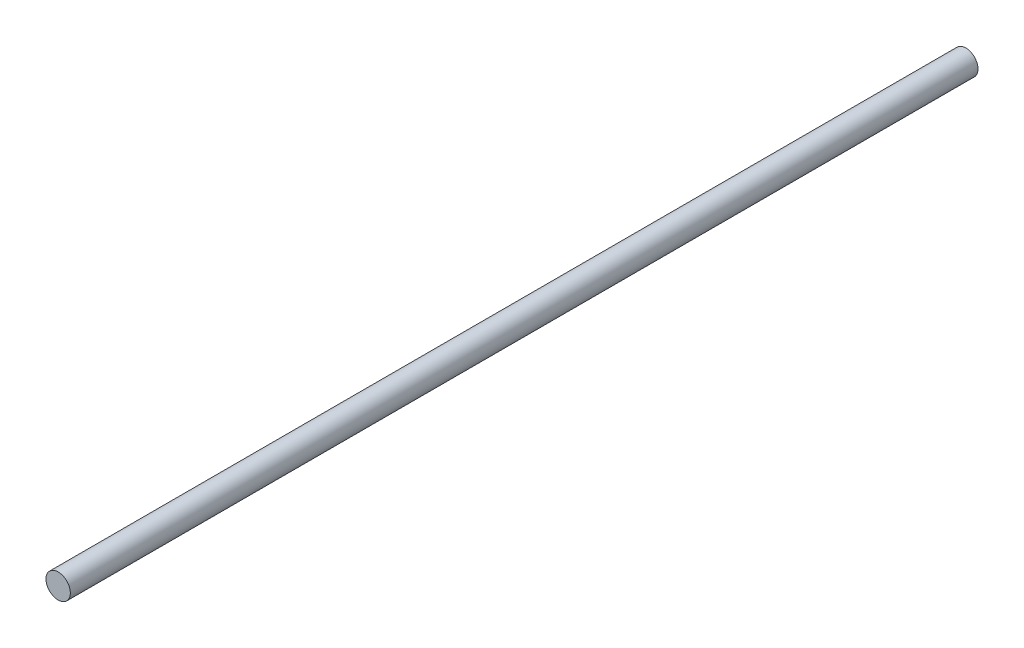
ISO-10303-21;
HEADER;
FILE_DESCRIPTION(('STEP AP214'),'2;1');
FILE_NAME('part.step','',(''),(''),'','','');
FILE_SCHEMA(('AUTOMOTIVE_DESIGN { 1 0 10303 214 1 1 1 1 }'));
ENDSEC;
DATA;
#1=APPLICATION_CONTEXT('core data for automotive mechanical design processes');
#2=APPLICATION_PROTOCOL_DEFINITION('international standard','automotive_design',2000,#1);
#3=PRODUCT_CONTEXT('',#1,'mechanical');
#4=PRODUCT('Part','Part','',(#3));
#5=PRODUCT_RELATED_PRODUCT_CATEGORY('part','',(#4));
#6=PRODUCT_DEFINITION_FORMATION('','',#4);
#7=PRODUCT_DEFINITION_CONTEXT('part definition',#1,'design');
#8=PRODUCT_DEFINITION('design','',#6,#7);
#9=PRODUCT_DEFINITION_SHAPE('','',#8);
#10=(LENGTH_UNIT() NAMED_UNIT(*) SI_UNIT(.MILLI.,.METRE.));
#11=(NAMED_UNIT(*) PLANE_ANGLE_UNIT() SI_UNIT($,.RADIAN.));
#12=(NAMED_UNIT(*) SI_UNIT($,.STERADIAN.) SOLID_ANGLE_UNIT());
#13=UNCERTAINTY_MEASURE_WITH_UNIT(LENGTH_MEASURE(1.E-05),#10,'distance_accuracy_value','');
#14=(GEOMETRIC_REPRESENTATION_CONTEXT(3) GLOBAL_UNCERTAINTY_ASSIGNED_CONTEXT((#13)) GLOBAL_UNIT_ASSIGNED_CONTEXT((#10,
#11,#12)) REPRESENTATION_CONTEXT('',''));
#15=CARTESIAN_POINT('',(0.,0.,0.));
#16=DIRECTION('',(0.,0.,1.));
#17=DIRECTION('',(1.,0.,0.));
#18=AXIS2_PLACEMENT_3D('',#15,#16,#17);
#19=CARTESIAN_POINT('',(0.,0.,-1000.));
#20=DIRECTION('',(0.,0.,1.));
#21=DIRECTION('',(1.,0.,0.));
#22=AXIS2_PLACEMENT_3D('',#19,#20,#21);
#23=CYLINDRICAL_SURFACE('',#22,51.);
#24=CARTESIAN_POINT('',(0.,0.,-1000.));
#25=DIRECTION('',(0.,0.,1.));
#26=DIRECTION('',(1.,0.,0.));
#27=AXIS2_PLACEMENT_3D('',#24,#25,#26);
#28=CIRCLE('',#27,51.);
#29=CARTESIAN_POINT('',(51.,0.,-1000.));
#30=VERTEX_POINT('',#29);
#31=EDGE_CURVE('E11',#30,#30,#28,.T.);
#32=ORIENTED_EDGE('',*,*,#31,.T.);
#33=EDGE_LOOP('',(#32));
#34=FACE_BOUND('',#33,.T.);
#35=CARTESIAN_POINT('',(0.,0.,2800.));
#36=DIRECTION('',(0.,0.,1.));
#37=DIRECTION('',(1.,0.,0.));
#38=AXIS2_PLACEMENT_3D('',#35,#36,#37);
#39=CIRCLE('',#38,51.);
#40=CARTESIAN_POINT('',(51.,0.,2800.));
#41=VERTEX_POINT('',#40);
#42=EDGE_CURVE('E40',#41,#41,#39,.T.);
#43=ORIENTED_EDGE('',*,*,#42,.F.);
#44=EDGE_LOOP('',(#43));
#45=FACE_BOUND('',#44,.T.);
#46=ADVANCED_FACE('F34',(#34,#45),#23,.T.);
#47=CARTESIAN_POINT('',(0.,0.,-1000.));
#48=DIRECTION('',(0.,0.,1.));
#49=DIRECTION('',(1.,0.,0.));
#50=AXIS2_PLACEMENT_3D('',#47,#48,#49);
#51=PLANE('',#50);
#52=ORIENTED_EDGE('',*,*,#31,.F.);
#53=EDGE_LOOP('',(#52));
#54=FACE_BOUND('',#53,.T.);
#55=ADVANCED_FACE('F75',(#54),#51,.F.);
#56=CARTESIAN_POINT('',(0.,0.,2800.));
#57=DIRECTION('',(0.,0.,1.));
#58=DIRECTION('',(1.,0.,0.));
#59=AXIS2_PLACEMENT_3D('',#56,#57,#58);
#60=PLANE('',#59);
#61=ORIENTED_EDGE('',*,*,#42,.T.);
#62=EDGE_LOOP('',(#61));
#63=FACE_BOUND('',#62,.T.);
#64=ADVANCED_FACE('F74',(#63),#60,.T.);
#65=CLOSED_SHELL('',(#46,#55,#64));
#66=CARTESIAN_POINT('',(0.,0.,-1140.00714267494));
#67=DIRECTION('',(0.,0.,1.));
#68=DIRECTION('',(1.,0.,0.));
#69=AXIS2_PLACEMENT_3D('',#66,#67,#68);
#70=CYLINDRICAL_SURFACE('',#69,49.5);
#71=CARTESIAN_POINT('',(0.,0.,-990.));
#72=DIRECTION('',(0.,0.,1.));
#73=DIRECTION('',(1.,0.,0.));
#74=AXIS2_PLACEMENT_3D('',#71,#72,#73);
#75=CIRCLE('',#74,49.5);
#76=CARTESIAN_POINT('',(49.5,0.,-990.));
#77=VERTEX_POINT('',#76);
#78=EDGE_CURVE('E44',#77,#77,#75,.F.);
#79=ORIENTED_EDGE('',*,*,#78,.T.);
#80=EDGE_LOOP('',(#79));
#81=FACE_BOUND('',#80,.T.);
#82=CARTESIAN_POINT('',(0.,0.,2790.));
#83=DIRECTION('',(0.,0.,1.));
#84=DIRECTION('',(1.,0.,0.));
#85=AXIS2_PLACEMENT_3D('',#82,#83,#84);
#86=CIRCLE('',#85,49.5);
#87=CARTESIAN_POINT('',(49.5,0.,2790.));
#88=VERTEX_POINT('',#87);
#89=EDGE_CURVE('E48',#88,#88,#86,.T.);
#90=ORIENTED_EDGE('',*,*,#89,.T.);
#91=EDGE_LOOP('',(#90));
#92=FACE_BOUND('',#91,.T.);
#93=ADVANCED_FACE('F54',(#81,#92),#70,.F.);
#94=CARTESIAN_POINT('',(0.,0.,-990.));
#95=DIRECTION('',(0.,0.,1.));
#96=DIRECTION('',(1.,0.,0.));
#97=AXIS2_PLACEMENT_3D('',#94,#95,#96);
#98=PLANE('',#97);
#99=ORIENTED_EDGE('',*,*,#78,.F.);
#100=EDGE_LOOP('',(#99));
#101=FACE_BOUND('',#100,.T.);
#102=ADVANCED_FACE('F58',(#101),#98,.T.);
#103=CARTESIAN_POINT('',(0.,0.,2790.));
#104=DIRECTION('',(0.,0.,1.));
#105=DIRECTION('',(1.,0.,0.));
#106=AXIS2_PLACEMENT_3D('',#103,#104,#105);
#107=PLANE('',#106);
#108=ORIENTED_EDGE('',*,*,#89,.F.);
#109=EDGE_LOOP('',(#108));
#110=FACE_BOUND('',#109,.T.);
#111=ADVANCED_FACE('F56',(#110),#107,.F.);
#112=CLOSED_SHELL('',(#93,#102,#111));
#113=ORIENTED_CLOSED_SHELL('',*,#112,.T.);
#114=BREP_WITH_VOIDS('B2',#65,(#113));
#115=ADVANCED_BREP_SHAPE_REPRESENTATION('',(#18,#114),#14);
#116=SHAPE_DEFINITION_REPRESENTATION(#9,#115);
ENDSEC;
END-ISO-10303-21;
